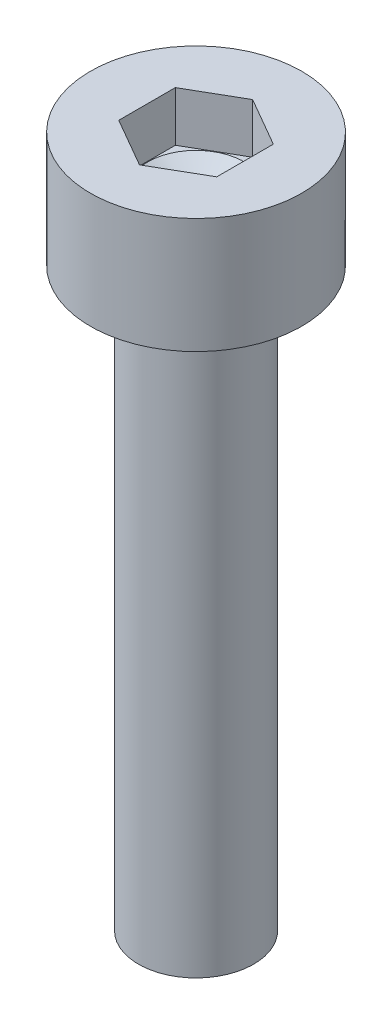
ISO-10303-21;
HEADER;
FILE_DESCRIPTION(('STEP AP214'),'2;1');
FILE_NAME('part.step','',(''),(''),'','','');
FILE_SCHEMA(('AUTOMOTIVE_DESIGN { 1 0 10303 214 1 1 1 1 }'));
ENDSEC;
DATA;
#1=APPLICATION_CONTEXT('core data for automotive mechanical design processes');
#2=APPLICATION_PROTOCOL_DEFINITION('international standard','automotive_design',2000,#1);
#3=PRODUCT_CONTEXT('',#1,'mechanical');
#4=PRODUCT('Part','Part','',(#3));
#5=PRODUCT_RELATED_PRODUCT_CATEGORY('part','',(#4));
#6=PRODUCT_DEFINITION_FORMATION('','',#4);
#7=PRODUCT_DEFINITION_CONTEXT('part definition',#1,'design');
#8=PRODUCT_DEFINITION('design','',#6,#7);
#9=PRODUCT_DEFINITION_SHAPE('','',#8);
#10=(LENGTH_UNIT() NAMED_UNIT(*) SI_UNIT(.MILLI.,.METRE.));
#11=(NAMED_UNIT(*) PLANE_ANGLE_UNIT() SI_UNIT($,.RADIAN.));
#12=(NAMED_UNIT(*) SI_UNIT($,.STERADIAN.) SOLID_ANGLE_UNIT());
#13=UNCERTAINTY_MEASURE_WITH_UNIT(LENGTH_MEASURE(1.E-05),#10,'distance_accuracy_value','');
#14=(GEOMETRIC_REPRESENTATION_CONTEXT(3) GLOBAL_UNCERTAINTY_ASSIGNED_CONTEXT((#13)) GLOBAL_UNIT_ASSIGNED_CONTEXT((#10,
#11,#12)) REPRESENTATION_CONTEXT('',''));
#15=CARTESIAN_POINT('',(0.,0.,0.));
#16=DIRECTION('',(0.,0.,1.));
#17=DIRECTION('',(1.,0.,0.));
#18=AXIS2_PLACEMENT_3D('',#15,#16,#17);
#19=CARTESIAN_POINT('',(0.,0.,0.));
#20=DIRECTION('',(0.,-1.,0.));
#21=DIRECTION('',(0.,0.,-1.));
#22=AXIS2_PLACEMENT_3D('',#19,#20,#21);
#23=PLANE('',#22);
#24=CARTESIAN_POINT('',(0.,0.,0.));
#25=DIRECTION('',(0.,-1.,0.));
#26=DIRECTION('',(0.,0.,-1.));
#27=AXIS2_PLACEMENT_3D('',#24,#25,#26);
#28=CIRCLE('',#27,2.75);
#29=CARTESIAN_POINT('',(0.,0.,-2.75));
#30=VERTEX_POINT('',#29);
#31=EDGE_CURVE('E11',#30,#30,#28,.T.);
#32=ORIENTED_EDGE('',*,*,#31,.T.);
#33=EDGE_LOOP('',(#32));
#34=FACE_BOUND('',#33,.T.);
#35=CARTESIAN_POINT('',(0.,0.,0.));
#36=DIRECTION('',(0.,-1.,0.));
#37=DIRECTION('',(0.,0.,-1.));
#38=AXIS2_PLACEMENT_3D('',#35,#36,#37);
#39=CIRCLE('',#38,1.5);
#40=CARTESIAN_POINT('',(0.,0.,-1.5));
#41=VERTEX_POINT('',#40);
#42=EDGE_CURVE('E143',#41,#41,#39,.T.);
#43=ORIENTED_EDGE('',*,*,#42,.F.);
#44=EDGE_LOOP('',(#43));
#45=FACE_BOUND('',#44,.T.);
#46=ADVANCED_FACE('F17',(#34,#45),#23,.T.);
#47=CARTESIAN_POINT('',(0.,0.,0.));
#48=DIRECTION('',(0.,-1.,0.));
#49=DIRECTION('',(0.,0.,-1.));
#50=AXIS2_PLACEMENT_3D('',#47,#48,#49);
#51=CYLINDRICAL_SURFACE('',#50,2.75);
#52=CARTESIAN_POINT('',(0.,3.,0.));
#53=DIRECTION('',(0.,-1.,0.));
#54=DIRECTION('',(0.,0.,-1.));
#55=AXIS2_PLACEMENT_3D('',#52,#53,#54);
#56=CIRCLE('',#55,2.75);
#57=CARTESIAN_POINT('',(0.,3.,-2.75));
#58=VERTEX_POINT('',#57);
#59=EDGE_CURVE('E24',#58,#58,#56,.T.);
#60=ORIENTED_EDGE('',*,*,#59,.T.);
#61=EDGE_LOOP('',(#60));
#62=FACE_BOUND('',#61,.T.);
#63=ORIENTED_EDGE('',*,*,#31,.F.);
#64=EDGE_LOOP('',(#63));
#65=FACE_BOUND('',#64,.T.);
#66=ADVANCED_FACE('F120',(#62,#65),#51,.T.);
#67=CARTESIAN_POINT('',(2.75,3.,0.));
#68=DIRECTION('',(0.,1.,0.));
#69=DIRECTION('',(0.,0.,1.));
#70=AXIS2_PLACEMENT_3D('',#67,#68,#69);
#71=PLANE('',#70);
#72=DIRECTION('',(-0.866025403784439,0.,-0.5));
#73=VECTOR('',#72,1.);
#74=CARTESIAN_POINT('',(1.275,3.,-0.736121593216773));
#75=LINE('',#74,#73);
#76=CARTESIAN_POINT('',(1.275,3.,-0.736121593216773));
#77=VERTEX_POINT('',#76);
#78=CARTESIAN_POINT('',(0.,3.,-1.47224318643355));
#79=VERTEX_POINT('',#78);
#80=EDGE_CURVE('E31',#77,#79,#75,.T.);
#81=ORIENTED_EDGE('',*,*,#80,.F.);
#82=DIRECTION('',(0.,0.,-1.));
#83=VECTOR('',#82,1.);
#84=CARTESIAN_POINT('',(1.275,3.,0.736121593216772));
#85=LINE('',#84,#83);
#86=CARTESIAN_POINT('',(1.275,3.,0.736121593216772));
#87=VERTEX_POINT('',#86);
#88=EDGE_CURVE('E101',#87,#77,#85,.T.);
#89=ORIENTED_EDGE('',*,*,#88,.F.);
#90=DIRECTION('',(0.866025403784439,0.,-0.5));
#91=VECTOR('',#90,1.);
#92=CARTESIAN_POINT('',(0.,3.,1.47224318643355));
#93=LINE('',#92,#91);
#94=CARTESIAN_POINT('',(0.,3.,1.47224318643355));
#95=VERTEX_POINT('',#94);
#96=EDGE_CURVE('E95',#95,#87,#93,.T.);
#97=ORIENTED_EDGE('',*,*,#96,.F.);
#98=DIRECTION('',(0.866025403784439,0.,0.5));
#99=VECTOR('',#98,1.);
#100=CARTESIAN_POINT('',(-1.275,3.,0.736121593216773));
#101=LINE('',#100,#99);
#102=CARTESIAN_POINT('',(-1.275,3.,0.736121593216773));
#103=VERTEX_POINT('',#102);
#104=EDGE_CURVE('E93',#103,#95,#101,.T.);
#105=ORIENTED_EDGE('',*,*,#104,.F.);
#106=DIRECTION('',(0.,0.,1.));
#107=VECTOR('',#106,1.);
#108=CARTESIAN_POINT('',(-1.275,3.,-0.736121593216773));
#109=LINE('',#108,#107);
#110=CARTESIAN_POINT('',(-1.275,3.,-0.736121593216773));
#111=VERTEX_POINT('',#110);
#112=EDGE_CURVE('E75',#111,#103,#109,.T.);
#113=ORIENTED_EDGE('',*,*,#112,.F.);
#114=DIRECTION('',(-0.866025403784439,0.,0.5));
#115=VECTOR('',#114,1.);
#116=CARTESIAN_POINT('',(0.,3.,-1.47224318643354));
#117=LINE('',#116,#115);
#118=EDGE_CURVE('E85',#79,#111,#117,.T.);
#119=ORIENTED_EDGE('',*,*,#118,.F.);
#120=EDGE_LOOP('',(#81,#89,#97,#105,#113,#119));
#121=FACE_BOUND('',#120,.T.);
#122=ORIENTED_EDGE('',*,*,#59,.F.);
#123=EDGE_LOOP('',(#122));
#124=FACE_BOUND('',#123,.T.);
#125=ADVANCED_FACE('F89',(#121,#124),#71,.T.);
#126=CARTESIAN_POINT('',(1.275,-2.19518934071246,-0.736121593216773));
#127=DIRECTION('',(0.5,0.,-0.866025403784439));
#128=DIRECTION('',(-0.866025403784439,0.,-0.5));
#129=AXIS2_PLACEMENT_3D('',#126,#127,#128);
#130=PLANE('',#129);
#131=DIRECTION('',(0.866025403784439,0.,0.5));
#132=VECTOR('',#131,1.);
#133=CARTESIAN_POINT('',(1.275,1.7,-0.736121593216773));
#134=LINE('',#133,#132);
#135=CARTESIAN_POINT('',(0.,1.7,-1.47224318643354));
#136=VERTEX_POINT('',#135);
#137=CARTESIAN_POINT('',(1.275,1.7,-0.736121593216773));
#138=VERTEX_POINT('',#137);
#139=EDGE_CURVE('E115',#136,#138,#134,.T.);
#140=ORIENTED_EDGE('',*,*,#139,.T.);
#141=DIRECTION('',(0.,1.,0.));
#142=VECTOR('',#141,1.);
#143=CARTESIAN_POINT('',(1.275,-2.19518934071246,-0.736121593216773));
#144=LINE('',#143,#142);
#145=EDGE_CURVE('E104',#138,#77,#144,.T.);
#146=ORIENTED_EDGE('',*,*,#145,.T.);
#147=ORIENTED_EDGE('',*,*,#80,.T.);
#148=DIRECTION('',(0.,1.,0.));
#149=VECTOR('',#148,1.);
#150=CARTESIAN_POINT('',(0.,-2.19518934071246,-1.47224318643354));
#151=LINE('',#150,#149);
#152=EDGE_CURVE('E82',#136,#79,#151,.T.);
#153=ORIENTED_EDGE('',*,*,#152,.F.);
#154=EDGE_LOOP('',(#140,#146,#147,#153));
#155=FACE_BOUND('',#154,.T.);
#156=ADVANCED_FACE('F123',(#155),#130,.F.);
#157=CARTESIAN_POINT('',(1.275,-2.19518934071246,0.736121593216772));
#158=DIRECTION('',(1.,0.,0.));
#159=DIRECTION('',(0.,0.,-1.));
#160=AXIS2_PLACEMENT_3D('',#157,#158,#159);
#161=PLANE('',#160);
#162=DIRECTION('',(0.,0.,1.));
#163=VECTOR('',#162,1.);
#164=CARTESIAN_POINT('',(1.275,1.7,0.736121593216772));
#165=LINE('',#164,#163);
#166=CARTESIAN_POINT('',(1.275,1.7,0.736121593216772));
#167=VERTEX_POINT('',#166);
#168=EDGE_CURVE('E155',#138,#167,#165,.T.);
#169=ORIENTED_EDGE('',*,*,#168,.T.);
#170=DIRECTION('',(0.,1.,0.));
#171=VECTOR('',#170,1.);
#172=CARTESIAN_POINT('',(1.275,-2.19518934071246,0.736121593216772));
#173=LINE('',#172,#171);
#174=EDGE_CURVE('E106',#167,#87,#173,.T.);
#175=ORIENTED_EDGE('',*,*,#174,.T.);
#176=ORIENTED_EDGE('',*,*,#88,.T.);
#177=ORIENTED_EDGE('',*,*,#145,.F.);
#178=EDGE_LOOP('',(#169,#175,#176,#177));
#179=FACE_BOUND('',#178,.T.);
#180=ADVANCED_FACE('F131',(#179),#161,.F.);
#181=CARTESIAN_POINT('',(0.,-2.19518934071246,1.47224318643355));
#182=DIRECTION('',(0.5,0.,0.866025403784438));
#183=DIRECTION('',(0.866025403784439,0.,-0.5));
#184=AXIS2_PLACEMENT_3D('',#181,#182,#183);
#185=PLANE('',#184);
#186=DIRECTION('',(-0.866025403784439,0.,0.5));
#187=VECTOR('',#186,1.);
#188=CARTESIAN_POINT('',(0.,1.7,1.47224318643355));
#189=LINE('',#188,#187);
#190=CARTESIAN_POINT('',(0.,1.7,1.47224318643355));
#191=VERTEX_POINT('',#190);
#192=EDGE_CURVE('E153',#167,#191,#189,.T.);
#193=ORIENTED_EDGE('',*,*,#192,.T.);
#194=DIRECTION('',(0.,1.,0.));
#195=VECTOR('',#194,1.);
#196=CARTESIAN_POINT('',(0.,-2.19518934071246,1.47224318643355));
#197=LINE('',#196,#195);
#198=EDGE_CURVE('E108',#191,#95,#197,.T.);
#199=ORIENTED_EDGE('',*,*,#198,.T.);
#200=ORIENTED_EDGE('',*,*,#96,.T.);
#201=ORIENTED_EDGE('',*,*,#174,.F.);
#202=EDGE_LOOP('',(#193,#199,#200,#201));
#203=FACE_BOUND('',#202,.T.);
#204=ADVANCED_FACE('F168',(#203),#185,.F.);
#205=CARTESIAN_POINT('',(-1.275,-2.19518934071246,0.736121593216773));
#206=DIRECTION('',(-0.5,0.,0.866025403784439));
#207=DIRECTION('',(0.866025403784439,0.,0.5));
#208=AXIS2_PLACEMENT_3D('',#205,#206,#207);
#209=PLANE('',#208);
#210=DIRECTION('',(-0.866025403784439,0.,-0.5));
#211=VECTOR('',#210,1.);
#212=CARTESIAN_POINT('',(-1.275,1.7,0.736121593216773));
#213=LINE('',#212,#211);
#214=CARTESIAN_POINT('',(-1.275,1.7,0.736121593216773));
#215=VERTEX_POINT('',#214);
#216=EDGE_CURVE('E151',#191,#215,#213,.T.);
#217=ORIENTED_EDGE('',*,*,#216,.T.);
#218=DIRECTION('',(0.,1.,0.));
#219=VECTOR('',#218,1.);
#220=CARTESIAN_POINT('',(-1.275,-2.19518934071246,0.736121593216773));
#221=LINE('',#220,#219);
#222=EDGE_CURVE('E81',#215,#103,#221,.T.);
#223=ORIENTED_EDGE('',*,*,#222,.T.);
#224=ORIENTED_EDGE('',*,*,#104,.T.);
#225=ORIENTED_EDGE('',*,*,#198,.F.);
#226=EDGE_LOOP('',(#217,#223,#224,#225));
#227=FACE_BOUND('',#226,.T.);
#228=ADVANCED_FACE('F171',(#227),#209,.F.);
#229=CARTESIAN_POINT('',(-1.275,-2.19518934071246,-0.736121593216773));
#230=DIRECTION('',(-1.,0.,0.));
#231=DIRECTION('',(0.,0.,1.));
#232=AXIS2_PLACEMENT_3D('',#229,#230,#231);
#233=PLANE('',#232);
#234=DIRECTION('',(0.,0.,-1.));
#235=VECTOR('',#234,1.);
#236=CARTESIAN_POINT('',(-1.275,1.7,-0.736121593216773));
#237=LINE('',#236,#235);
#238=CARTESIAN_POINT('',(-1.275,1.7,-0.736121593216773));
#239=VERTEX_POINT('',#238);
#240=EDGE_CURVE('E78',#215,#239,#237,.T.);
#241=ORIENTED_EDGE('',*,*,#240,.T.);
#242=DIRECTION('',(0.,1.,0.));
#243=VECTOR('',#242,1.);
#244=CARTESIAN_POINT('',(-1.275,-2.19518934071246,-0.736121593216773));
#245=LINE('',#244,#243);
#246=EDGE_CURVE('E70',#239,#111,#245,.T.);
#247=ORIENTED_EDGE('',*,*,#246,.T.);
#248=ORIENTED_EDGE('',*,*,#112,.T.);
#249=ORIENTED_EDGE('',*,*,#222,.F.);
#250=EDGE_LOOP('',(#241,#247,#248,#249));
#251=FACE_BOUND('',#250,.T.);
#252=ADVANCED_FACE('F72',(#251),#233,.F.);
#253=CARTESIAN_POINT('',(0.,-2.19518934071246,-1.47224318643354));
#254=DIRECTION('',(-0.5,0.,-0.866025403784439));
#255=DIRECTION('',(-0.866025403784439,0.,0.5));
#256=AXIS2_PLACEMENT_3D('',#253,#254,#255);
#257=PLANE('',#256);
#258=DIRECTION('',(0.866025403784439,0.,-0.5));
#259=VECTOR('',#258,1.);
#260=CARTESIAN_POINT('',(0.,1.7,-1.47224318643354));
#261=LINE('',#260,#259);
#262=EDGE_CURVE('E112',#239,#136,#261,.T.);
#263=ORIENTED_EDGE('',*,*,#262,.T.);
#264=ORIENTED_EDGE('',*,*,#152,.T.);
#265=ORIENTED_EDGE('',*,*,#118,.T.);
#266=ORIENTED_EDGE('',*,*,#246,.F.);
#267=EDGE_LOOP('',(#263,#264,#265,#266));
#268=FACE_BOUND('',#267,.T.);
#269=ADVANCED_FACE('F86',(#268),#257,.F.);
#270=CARTESIAN_POINT('',(0.,1.7,0.));
#271=DIRECTION('',(0.,1.,0.));
#272=DIRECTION('',(0.,0.,1.));
#273=AXIS2_PLACEMENT_3D('',#270,#271,#272);
#274=PLANE('',#273);
#275=CARTESIAN_POINT('',(0.,1.7,0.));
#276=DIRECTION('',(0.,1.,0.));
#277=DIRECTION('',(0.,0.,1.));
#278=AXIS2_PLACEMENT_3D('',#275,#276,#277);
#279=CIRCLE('',#278,1.26);
#280=CARTESIAN_POINT('',(0.,1.7,1.26));
#281=VERTEX_POINT('',#280);
#282=EDGE_CURVE('E114',#281,#281,#279,.T.);
#283=ORIENTED_EDGE('',*,*,#282,.F.);
#284=EDGE_LOOP('',(#283));
#285=FACE_BOUND('',#284,.T.);
#286=ORIENTED_EDGE('',*,*,#139,.F.);
#287=ORIENTED_EDGE('',*,*,#262,.F.);
#288=ORIENTED_EDGE('',*,*,#240,.F.);
#289=ORIENTED_EDGE('',*,*,#216,.F.);
#290=ORIENTED_EDGE('',*,*,#192,.F.);
#291=ORIENTED_EDGE('',*,*,#168,.F.);
#292=EDGE_LOOP('',(#286,#287,#288,#289,#290,#291));
#293=FACE_BOUND('',#292,.T.);
#294=ADVANCED_FACE('F162',(#285,#293),#274,.T.);
#295=CARTESIAN_POINT('',(0.,1.7,0.));
#296=DIRECTION('',(0.,1.,0.));
#297=DIRECTION('',(0.,0.,1.));
#298=AXIS2_PLACEMENT_3D('',#295,#296,#297);
#299=CONICAL_SURFACE('',#298,1.26,1.0471975511966);
#300=CARTESIAN_POINT('',(0.,0.972538660821063,0.));
#301=VERTEX_POINT('',#300);
#302=VERTEX_LOOP('',#301);
#303=FACE_BOUND('',#302,.T.);
#304=ORIENTED_EDGE('',*,*,#282,.T.);
#305=EDGE_LOOP('',(#304));
#306=FACE_BOUND('',#305,.T.);
#307=ADVANCED_FACE('F184',(#303,#306),#299,.F.);
#308=CARTESIAN_POINT('',(0.,-15.,0.));
#309=DIRECTION('',(0.,1.,0.));
#310=DIRECTION('',(0.,0.,1.));
#311=AXIS2_PLACEMENT_3D('',#308,#309,#310);
#312=CYLINDRICAL_SURFACE('',#311,1.5);
#313=CARTESIAN_POINT('',(0.,-15.,0.));
#314=DIRECTION('',(0.,-1.,0.));
#315=DIRECTION('',(0.,0.,-1.));
#316=AXIS2_PLACEMENT_3D('',#313,#314,#315);
#317=CIRCLE('',#316,1.5);
#318=CARTESIAN_POINT('',(0.,-15.,-1.5));
#319=VERTEX_POINT('',#318);
#320=EDGE_CURVE('E145',#319,#319,#317,.T.);
#321=ORIENTED_EDGE('',*,*,#320,.F.);
#322=EDGE_LOOP('',(#321));
#323=FACE_BOUND('',#322,.T.);
#324=ORIENTED_EDGE('',*,*,#42,.T.);
#325=EDGE_LOOP('',(#324));
#326=FACE_BOUND('',#325,.T.);
#327=ADVANCED_FACE('F186',(#323,#326),#312,.T.);
#328=CARTESIAN_POINT('',(0.,-15.,0.));
#329=DIRECTION('',(0.,-1.,0.));
#330=DIRECTION('',(0.,0.,-1.));
#331=AXIS2_PLACEMENT_3D('',#328,#329,#330);
#332=PLANE('',#331);
#333=ORIENTED_EDGE('',*,*,#320,.T.);
#334=EDGE_LOOP('',(#333));
#335=FACE_BOUND('',#334,.T.);
#336=ADVANCED_FACE('F192',(#335),#332,.T.);
#337=CLOSED_SHELL('',(#46,#66,#125,#156,#180,#204,#228,#252,#269,#294,#307,#327,#336));
#338=MANIFOLD_SOLID_BREP('B1',#337);
#339=ADVANCED_BREP_SHAPE_REPRESENTATION('',(#18,#338),#14);
#340=SHAPE_DEFINITION_REPRESENTATION(#9,#339);
ENDSEC;
END-ISO-10303-21;
